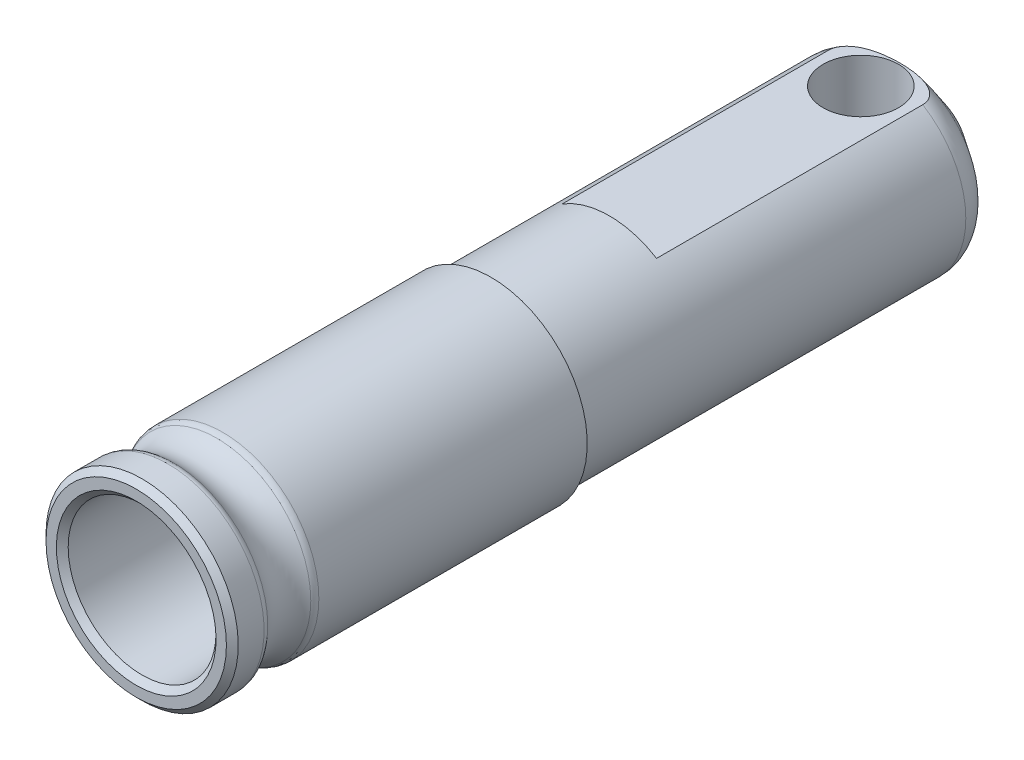
ISO-10303-21;
HEADER;
FILE_DESCRIPTION(('STEP AP214'),'2;1');
FILE_NAME('part.step','',(''),(''),'','','');
FILE_SCHEMA(('AUTOMOTIVE_DESIGN { 1 0 10303 214 1 1 1 1 }'));
ENDSEC;
DATA;
#1=APPLICATION_CONTEXT('core data for automotive mechanical design processes');
#2=APPLICATION_PROTOCOL_DEFINITION('international standard','automotive_design',2000,#1);
#3=PRODUCT_CONTEXT('',#1,'mechanical');
#4=PRODUCT('Part','Part','',(#3));
#5=PRODUCT_RELATED_PRODUCT_CATEGORY('part','',(#4));
#6=PRODUCT_DEFINITION_FORMATION('','',#4);
#7=PRODUCT_DEFINITION_CONTEXT('part definition',#1,'design');
#8=PRODUCT_DEFINITION('design','',#6,#7);
#9=PRODUCT_DEFINITION_SHAPE('','',#8);
#10=(LENGTH_UNIT() NAMED_UNIT(*) SI_UNIT(.MILLI.,.METRE.));
#11=(NAMED_UNIT(*) PLANE_ANGLE_UNIT() SI_UNIT($,.RADIAN.));
#12=(NAMED_UNIT(*) SI_UNIT($,.STERADIAN.) SOLID_ANGLE_UNIT());
#13=UNCERTAINTY_MEASURE_WITH_UNIT(LENGTH_MEASURE(1.E-05),#10,'distance_accuracy_value','');
#14=(GEOMETRIC_REPRESENTATION_CONTEXT(3) GLOBAL_UNCERTAINTY_ASSIGNED_CONTEXT((#13)) GLOBAL_UNIT_ASSIGNED_CONTEXT((#10,
#11,#12)) REPRESENTATION_CONTEXT('',''));
#15=CARTESIAN_POINT('',(0.,0.,0.));
#16=DIRECTION('',(0.,0.,1.));
#17=DIRECTION('',(1.,0.,0.));
#18=AXIS2_PLACEMENT_3D('',#15,#16,#17);
#19=CARTESIAN_POINT('',(0.,0.,-2.));
#20=DIRECTION('',(0.,0.,1.));
#21=DIRECTION('',(1.,0.,0.));
#22=AXIS2_PLACEMENT_3D('',#19,#20,#21);
#23=PLANE('',#22);
#24=CARTESIAN_POINT('',(0.,0.,-2.));
#25=DIRECTION('',(0.,0.,-1.));
#26=DIRECTION('',(-1.,0.,0.));
#27=AXIS2_PLACEMENT_3D('',#24,#25,#26);
#28=CIRCLE('',#27,2.5);
#29=CARTESIAN_POINT('',(-2.5,0.,-2.));
#30=VERTEX_POINT('',#29);
#31=EDGE_CURVE('E272',#30,#30,#28,.F.);
#32=ORIENTED_EDGE('',*,*,#31,.T.);
#33=EDGE_LOOP('',(#32));
#34=FACE_BOUND('',#33,.T.);
#35=ADVANCED_FACE('F24',(#34),#23,.T.);
#36=CARTESIAN_POINT('',(0.,0.,15.));
#37=DIRECTION('',(0.,0.,-1.));
#38=DIRECTION('',(-1.,0.,0.));
#39=AXIS2_PLACEMENT_3D('',#36,#37,#38);
#40=CYLINDRICAL_SURFACE('',#39,2.5);
#41=CARTESIAN_POINT('',(0.,0.,6.79999999999836));
#42=DIRECTION('',(0.,0.,1.));
#43=DIRECTION('',(1.,0.,0.));
#44=AXIS2_PLACEMENT_3D('',#41,#42,#43);
#45=CIRCLE('',#44,2.50000000005457);
#46=CARTESIAN_POINT('',(2.50000000005457,0.,6.79999999999836));
#47=VERTEX_POINT('',#46);
#48=EDGE_CURVE('E268',#47,#47,#45,.T.);
#49=ORIENTED_EDGE('',*,*,#48,.T.);
#50=EDGE_LOOP('',(#49));
#51=FACE_BOUND('',#50,.T.);
#52=ORIENTED_EDGE('',*,*,#31,.F.);
#53=EDGE_LOOP('',(#52));
#54=FACE_BOUND('',#53,.T.);
#55=ADVANCED_FACE('F459',(#51,#54),#40,.F.);
#56=CARTESIAN_POINT('',(0.,0.,6.99999999994816));
#57=DIRECTION('',(0.,0.,1.));
#58=DIRECTION('',(0.,-1.,0.));
#59=AXIS2_PLACEMENT_3D('',#56,#57,#58);
#60=CONICAL_SURFACE('',#59,2.70000000000437,0.785398163397448);
#61=ORIENTED_EDGE('',*,*,#48,.F.);
#62=EDGE_LOOP('',(#61));
#63=FACE_BOUND('',#62,.T.);
#64=CARTESIAN_POINT('',(0.,0.,6.99999999994816));
#65=DIRECTION('',(0.,0.,1.));
#66=DIRECTION('',(0.,-1.,0.));
#67=AXIS2_PLACEMENT_3D('',#64,#65,#66);
#68=CIRCLE('',#67,2.70000000000437);
#69=CARTESIAN_POINT('',(0.,-2.70000000000437,6.99999999994816));
#70=VERTEX_POINT('',#69);
#71=EDGE_CURVE('E271',#70,#70,#68,.F.);
#72=ORIENTED_EDGE('',*,*,#71,.F.);
#73=EDGE_LOOP('',(#72));
#74=FACE_BOUND('',#73,.T.);
#75=ADVANCED_FACE('F450',(#63,#74),#60,.F.);
#76=CARTESIAN_POINT('',(0.,0.,7.));
#77=DIRECTION('',(0.,0.,1.));
#78=DIRECTION('',(1.,0.,0.));
#79=AXIS2_PLACEMENT_3D('',#76,#77,#78);
#80=PLANE('',#79);
#81=CARTESIAN_POINT('',(0.,0.,7.000000000005));
#82=DIRECTION('',(0.,0.,-1.));
#83=DIRECTION('',(0.,1.,0.));
#84=AXIS2_PLACEMENT_3D('',#81,#82,#83);
#85=CIRCLE('',#84,3.04999999997335);
#86=CARTESIAN_POINT('',(0.,3.04999999997335,7.000000000005));
#87=VERTEX_POINT('',#86);
#88=EDGE_CURVE('E277',#87,#87,#85,.T.);
#89=ORIENTED_EDGE('',*,*,#88,.F.);
#90=EDGE_LOOP('',(#89));
#91=FACE_BOUND('',#90,.T.);
#92=ORIENTED_EDGE('',*,*,#71,.T.);
#93=EDGE_LOOP('',(#92));
#94=FACE_BOUND('',#93,.T.);
#95=ADVANCED_FACE('F441',(#91,#94),#80,.T.);
#96=CARTESIAN_POINT('',(0.,0.,6.79999999994152));
#97=DIRECTION('',(0.,0.,-1.));
#98=DIRECTION('',(0.,1.,0.));
#99=AXIS2_PLACEMENT_3D('',#96,#97,#98);
#100=CONICAL_SURFACE('',#99,3.24999999997999,0.78539816325534);
#101=ORIENTED_EDGE('',*,*,#88,.T.);
#102=EDGE_LOOP('',(#101));
#103=FACE_BOUND('',#102,.T.);
#104=CARTESIAN_POINT('',(0.,0.,6.8));
#105=DIRECTION('',(0.,0.,-1.));
#106=DIRECTION('',(-1.,0.,0.));
#107=AXIS2_PLACEMENT_3D('',#104,#105,#106);
#108=CIRCLE('',#107,3.25);
#109=CARTESIAN_POINT('',(-3.25,0.,6.8));
#110=VERTEX_POINT('',#109);
#111=EDGE_CURVE('E273',#110,#110,#108,.T.);
#112=ORIENTED_EDGE('',*,*,#111,.F.);
#113=EDGE_LOOP('',(#112));
#114=FACE_BOUND('',#113,.T.);
#115=ADVANCED_FACE('F433',(#103,#114),#100,.T.);
#116=CARTESIAN_POINT('',(0.,0.,7.));
#117=DIRECTION('',(0.,0.,-1.));
#118=DIRECTION('',(-1.,0.,0.));
#119=AXIS2_PLACEMENT_3D('',#116,#117,#118);
#120=CYLINDRICAL_SURFACE('',#119,3.25);
#121=ORIENTED_EDGE('',*,*,#111,.T.);
#122=EDGE_LOOP('',(#121));
#123=FACE_BOUND('',#122,.T.);
#124=CARTESIAN_POINT('',(-1.7066633817537E-12,0.,5.92601295887262));
#125=DIRECTION('',(0.,0.,-1.));
#126=DIRECTION('',(-1.,0.,0.));
#127=AXIS2_PLACEMENT_3D('',#124,#125,#126);
#128=CIRCLE('',#127,3.25000000000171);
#129=CARTESIAN_POINT('',(-3.25000000000342,0.,5.92601295887263));
#130=VERTEX_POINT('',#129);
#131=EDGE_CURVE('E276',#130,#130,#128,.T.);
#132=ORIENTED_EDGE('',*,*,#131,.F.);
#133=EDGE_LOOP('',(#132));
#134=FACE_BOUND('',#133,.T.);
#135=ADVANCED_FACE('F426',(#123,#134),#120,.T.);
#136=CARTESIAN_POINT('',(-1.7066633817537E-12,0.,5.92601295887262));
#137=DIRECTION('',(0.,0.,-1.));
#138=DIRECTION('',(-1.,0.,0.));
#139=AXIS2_PLACEMENT_3D('',#136,#137,#138);
#140=TOROIDAL_SURFACE('',#139,2.95000000000171,0.3);
#141=ORIENTED_EDGE('',*,*,#131,.T.);
#142=EDGE_LOOP('',(#141));
#143=FACE_BOUND('',#142,.T.);
#144=CARTESIAN_POINT('',(-3.41052809989731E-12,0.,5.72758161054229));
#145=DIRECTION('',(0.,0.,1.));
#146=DIRECTION('',(1.,0.,0.));
#147=AXIS2_PLACEMENT_3D('',#144,#145,#146);
#148=CIRCLE('',#147,3.17500000000299);
#149=CARTESIAN_POINT('',(3.17499999999958,0.,5.72758161054228));
#150=VERTEX_POINT('',#149);
#151=EDGE_CURVE('E104',#150,#150,#148,.T.);
#152=ORIENTED_EDGE('',*,*,#151,.T.);
#153=EDGE_LOOP('',(#152));
#154=FACE_BOUND('',#153,.T.);
#155=ADVANCED_FACE('F126',(#143,#154),#140,.T.);
#156=CARTESIAN_POINT('',(0.,0.,-20.));
#157=DIRECTION('',(0.,0.,-1.));
#158=DIRECTION('',(-1.,0.,0.));
#159=AXIS2_PLACEMENT_3D('',#156,#157,#158);
#160=PLANE('',#159);
#161=CARTESIAN_POINT('',(0.,0.,-20.));
#162=DIRECTION('',(0.,0.,1.));
#163=DIRECTION('',(1.,0.,0.));
#164=AXIS2_PLACEMENT_3D('',#161,#162,#163);
#165=CIRCLE('',#164,0.716666666666765);
#166=CARTESIAN_POINT('',(0.716666666666676,0.,-20.));
#167=VERTEX_POINT('',#166);
#168=CARTESIAN_POINT('',(-0.716666666666853,0.,-20.));
#169=VERTEX_POINT('',#168);
#170=EDGE_CURVE('E100',#167,#169,#165,.T.);
#171=ORIENTED_EDGE('',*,*,#170,.F.);
#172=CARTESIAN_POINT('',(0.,0.,-20.));
#173=DIRECTION('',(0.,0.,1.));
#174=DIRECTION('',(-1.,0.,0.));
#175=AXIS2_PLACEMENT_3D('',#172,#173,#174);
#176=CIRCLE('',#175,0.716666666666765);
#177=EDGE_CURVE('E96',#169,#167,#176,.T.);
#178=ORIENTED_EDGE('',*,*,#177,.F.);
#179=EDGE_LOOP('',(#171,#178));
#180=FACE_BOUND('',#179,.T.);
#181=ADVANCED_FACE('F107',(#180),#160,.T.);
#182=CARTESIAN_POINT('',(-3.41306843898437E-12,0.,5.));
#183=DIRECTION('',(0.,0.,1.));
#184=DIRECTION('',(1.,0.,0.));
#185=AXIS2_PLACEMENT_3D('',#182,#183,#184);
#186=TOROIDAL_SURFACE('',#185,4.00000000000341,1.1);
#187=ORIENTED_EDGE('',*,*,#151,.F.);
#188=EDGE_LOOP('',(#187));
#189=FACE_BOUND('',#188,.T.);
#190=CARTESIAN_POINT('',(-1.70955013071626E-12,0.,4.27241838946452));
#191=DIRECTION('',(0.,0.,1.));
#192=DIRECTION('',(1.,0.,0.));
#193=AXIS2_PLACEMENT_3D('',#190,#191,#192);
#194=CIRCLE('',#193,3.17499999999869);
#195=CARTESIAN_POINT('',(3.17499999999698,0.,4.27241838946452));
#196=VERTEX_POINT('',#195);
#197=EDGE_CURVE('E108',#196,#196,#194,.F.);
#198=ORIENTED_EDGE('',*,*,#197,.F.);
#199=EDGE_LOOP('',(#198));
#200=FACE_BOUND('',#199,.T.);
#201=ADVANCED_FACE('F125',(#189,#200),#186,.F.);
#202=CARTESIAN_POINT('',(-0.716666666666853,0.,-19.));
#203=DIRECTION('',(0.,1.,0.));
#204=DIRECTION('',(-1.,0.,0.));
#205=AXIS2_PLACEMENT_3D('',#202,#203,#204);
#206=CIRCLE('',#205,1.);
#207=TRIMMED_CURVE('',#206,(PARAMETER_VALUE(-2.36980728294869)),
(PARAMETER_VALUE(2.36980728294869)),.T.,.PARAMETER.);
#208=CARTESIAN_POINT('',(0.,0.,-19.));
#209=DIRECTION('',(0.,0.,-1.));
#210=AXIS1_PLACEMENT('',#208,#209);
#211=SURFACE_OF_REVOLUTION('',#207,#210);
#212=ORIENTED_EDGE('',*,*,#177,.T.);
#213=ORIENTED_EDGE('',*,*,#170,.T.);
#214=EDGE_LOOP('',(#212,#213));
#215=FACE_BOUND('',#214,.T.);
#216=CARTESIAN_POINT('',(0.,0.,-19.7999999999752));
#217=DIRECTION('',(0.,0.,1.));
#218=DIRECTION('',(1.,0.,0.));
#219=AXIS2_PLACEMENT_3D('',#216,#217,#218);
#220=CIRCLE('',#219,1.31666666663942);
#221=CARTESIAN_POINT('',(1.31666666663932,0.,-19.7999999999752));
#222=VERTEX_POINT('',#221);
#223=EDGE_CURVE('E156',#222,#222,#220,.T.);
#224=ORIENTED_EDGE('',*,*,#223,.F.);
#225=EDGE_LOOP('',(#224));
#226=FACE_BOUND('',#225,.T.);
#227=ADVANCED_FACE('F98',(#215,#226),#211,.F.);
#228=CARTESIAN_POINT('',(-1.70989654059176E-12,0.,4.07398704113512));
#229=DIRECTION('',(0.,0.,1.));
#230=DIRECTION('',(1.,0.,0.));
#231=AXIS2_PLACEMENT_3D('',#228,#229,#230);
#232=TOROIDAL_SURFACE('',#231,2.9499999999983,0.3);
#233=CARTESIAN_POINT('',(0.,0.,4.07398704113512));
#234=DIRECTION('',(0.,0.,-1.));
#235=DIRECTION('',(-1.,0.,0.));
#236=AXIS2_PLACEMENT_3D('',#233,#234,#235);
#237=CIRCLE('',#236,3.25);
#238=CARTESIAN_POINT('',(-3.25,0.,4.07398704113512));
#239=VERTEX_POINT('',#238);
#240=EDGE_CURVE('E162',#239,#239,#237,.T.);
#241=ORIENTED_EDGE('',*,*,#240,.F.);
#242=EDGE_LOOP('',(#241));
#243=FACE_BOUND('',#242,.T.);
#244=ORIENTED_EDGE('',*,*,#197,.T.);
#245=EDGE_LOOP('',(#244));
#246=FACE_BOUND('',#245,.T.);
#247=ADVANCED_FACE('F150',(#243,#246),#232,.T.);
#248=CARTESIAN_POINT('',(-3.49256214227101E-12,-3.25,-17.5));
#249=DIRECTION('',(0.,1.,0.));
#250=DIRECTION('',(-1.,0.,0.));
#251=AXIS2_PLACEMENT_3D('',#248,#249,#250);
#252=CYLINDRICAL_SURFACE('',#251,1.275);
#253=CARTESIAN_POINT('',(-3.49154732903756E-12,2.6,-17.5));
#254=DIRECTION('',(0.,1.,0.));
#255=DIRECTION('',(-1.,0.,0.));
#256=AXIS2_PLACEMENT_3D('',#253,#254,#255);
#257=CIRCLE('',#256,1.275);
#258=CARTESIAN_POINT('',(-1.27500000000349,2.6,-17.5));
#259=VERTEX_POINT('',#258);
#260=EDGE_CURVE('E159',#259,#259,#257,.T.);
#261=ORIENTED_EDGE('',*,*,#260,.T.);
#262=EDGE_LOOP('',(#261));
#263=FACE_BOUND('',#262,.T.);
#264=CARTESIAN_POINT('',(-3.49244938524507E-12,-2.6,-17.5));
#265=DIRECTION('',(0.,1.,0.));
#266=DIRECTION('',(-1.,0.,0.));
#267=AXIS2_PLACEMENT_3D('',#264,#265,#266);
#268=CIRCLE('',#267,1.275);
#269=CARTESIAN_POINT('',(-1.27500000000349,-2.6,-17.5));
#270=VERTEX_POINT('',#269);
#271=EDGE_CURVE('E181',#270,#270,#268,.F.);
#272=ORIENTED_EDGE('',*,*,#271,.T.);
#273=EDGE_LOOP('',(#272));
#274=FACE_BOUND('',#273,.T.);
#275=ADVANCED_FACE('F292',(#263,#274),#252,.F.);
#276=CARTESIAN_POINT('',(0.,0.,-18.7999999999988));
#277=DIRECTION('',(0.,0.,1.));
#278=DIRECTION('',(1.,0.,0.));
#279=AXIS2_PLACEMENT_3D('',#276,#277,#278);
#280=CONICAL_SURFACE('',#279,2.64999999996017,0.92729521800843);
#281=CARTESIAN_POINT('',(0.,0.,-18.8));
#282=DIRECTION('',(0.,0.,-1.));
#283=DIRECTION('',(-1.,0.,0.));
#284=AXIS2_PLACEMENT_3D('',#281,#282,#283);
#285=CIRCLE('',#284,2.65000000000009);
#286=CARTESIAN_POINT('',(-0.512347538327393,2.6,-18.7999999999958));
#287=VERTEX_POINT('',#286);
#288=CARTESIAN_POINT('',(-0.512347538296274,-2.6,-18.7999999999848));
#289=VERTEX_POINT('',#288);
#290=EDGE_CURVE('E165',#287,#289,#285,.F.);
#291=ORIENTED_EDGE('',*,*,#290,.F.);
#292=CARTESIAN_POINT('',(-0.512347538322927,2.6,-18.7999999999653));
#293=CARTESIAN_POINT('',(-0.427332745589508,2.6,-18.8123767665102));
#294=CARTESIAN_POINT('',(-0.341863986310406,2.6,-18.8217687915117));
#295=CARTESIAN_POINT('',(-0.170928553538625,2.6,-18.834313983532));
#296=CARTESIAN_POINT('',(-0.0854642767766453,2.6,-18.837499999968));
#297=CARTESIAN_POINT('',(0.0854642767473424,2.6,-18.8374999999688));
#298=CARTESIAN_POINT('',(0.170928553509351,2.6,-18.8343139835334));
#299=CARTESIAN_POINT('',(0.341863986281238,2.6,-18.8217687915146));
#300=CARTESIAN_POINT('',(0.427332745560417,2.6,-18.8123767665137));
#301=CARTESIAN_POINT('',(0.512347538293935,2.6,-18.7999999999695));
#302=B_SPLINE_CURVE_WITH_KNOTS('',3,(#292,#293,#294,#295,#296,#297,#298,#299,#300,#301),
.UNSPECIFIED.,.F.,.F.,(4,2,2,2,4),(0.,0.257710646406221,0.514053441173921,0.770396235941626,
1.02810688234785),.UNSPECIFIED.);
#303=CARTESIAN_POINT('',(0.512347538296146,2.6,-18.7999999999848));
#304=VERTEX_POINT('',#303);
#305=EDGE_CURVE('E166',#287,#304,#302,.T.);
#306=ORIENTED_EDGE('',*,*,#305,.T.);
#307=CARTESIAN_POINT('',(0.,0.,-18.8));
#308=DIRECTION('',(0.,0.,-1.));
#309=DIRECTION('',(-1.,0.,0.));
#310=AXIS2_PLACEMENT_3D('',#307,#308,#309);
#311=CIRCLE('',#310,2.65000000000009);
#312=CARTESIAN_POINT('',(0.512347538296098,-2.6,-18.7999999999848));
#313=VERTEX_POINT('',#312);
#314=EDGE_CURVE('E229',#313,#304,#311,.F.);
#315=ORIENTED_EDGE('',*,*,#314,.F.);
#316=CARTESIAN_POINT('',(0.512347538293843,-2.6,-18.7999999999695));
#317=CARTESIAN_POINT('',(0.42733274556276,-2.6,-18.8123767665134));
#318=CARTESIAN_POINT('',(0.341863986286043,-2.6,-18.8217687915141));
#319=CARTESIAN_POINT('',(0.170928553519055,-2.6,-18.8343139835329));
#320=CARTESIAN_POINT('',(0.0854642767594833,-2.6,-18.8374999999684));
#321=CARTESIAN_POINT('',(-0.0854642767596595,-2.6,-18.8374999999684));
#322=CARTESIAN_POINT('',(-0.170928553519231,-2.6,-18.8343139835329));
#323=CARTESIAN_POINT('',(-0.341863986286219,-2.6,-18.8217687915141));
#324=CARTESIAN_POINT('',(-0.427332745562937,-2.6,-18.8123767665134));
#325=CARTESIAN_POINT('',(-0.512347538294019,-2.6,-18.7999999999695));
#326=B_SPLINE_CURVE_WITH_KNOTS('',3,(#316,#317,#318,#319,#320,#321,#322,#323,#324,#325),
.UNSPECIFIED.,.F.,.F.,(4,2,2,2,4),(0.,0.257710646398846,0.514053441159284,0.770396235919723,
1.02810688231857),.UNSPECIFIED.);
#327=EDGE_CURVE('E259',#313,#289,#326,.T.);
#328=ORIENTED_EDGE('',*,*,#327,.T.);
#329=EDGE_LOOP('',(#291,#306,#315,#328));
#330=FACE_BOUND('',#329,.T.);
#331=ORIENTED_EDGE('',*,*,#223,.T.);
#332=EDGE_LOOP('',(#331));
#333=FACE_BOUND('',#332,.T.);
#334=ADVANCED_FACE('F298',(#330,#333),#280,.T.);
#335=CARTESIAN_POINT('',(-16.5,3.25,-9.));
#336=DIRECTION('',(0.,0.,1.));
#337=DIRECTION('',(1.,0.,0.));
#338=AXIS2_PLACEMENT_3D('',#335,#336,#337);
#339=PLANE('',#338);
#340=CARTESIAN_POINT('',(0.,0.,-8.9999999999999));
#341=DIRECTION('',(0.,0.,1.));
#342=DIRECTION('',(1.,0.,0.));
#343=AXIS2_PLACEMENT_3D('',#340,#341,#342);
#344=CIRCLE('',#343,3.05000000000008);
#345=CARTESIAN_POINT('',(1.59452187191028,2.6,-8.9999999999999));
#346=VERTEX_POINT('',#345);
#347=CARTESIAN_POINT('',(-1.5945218719104,2.6,-8.9999999999999));
#348=VERTEX_POINT('',#347);
#349=EDGE_CURVE('E169',#346,#348,#344,.T.);
#350=ORIENTED_EDGE('',*,*,#349,.F.);
#351=DIRECTION('',(1.,0.,0.));
#352=VECTOR('',#351,1.);
#353=CARTESIAN_POINT('',(-16.5,2.6,-8.9999999999999));
#354=LINE('',#353,#352);
#355=EDGE_CURVE('E84',#346,#348,#354,.F.);
#356=ORIENTED_EDGE('',*,*,#355,.T.);
#357=EDGE_LOOP('',(#350,#356));
#358=FACE_BOUND('',#357,.T.);
#359=ADVANCED_FACE('F220',(#358),#339,.F.);
#360=CARTESIAN_POINT('',(-16.5,2.6,-9.));
#361=DIRECTION('',(0.,-1.,0.));
#362=DIRECTION('',(0.,0.,-1.));
#363=AXIS2_PLACEMENT_3D('',#360,#361,#362);
#364=PLANE('',#363);
#365=CARTESIAN_POINT('',(-1.59452187191043,2.6,-18.));
#366=CARTESIAN_POINT('',(-1.59452638455657,2.6,-18.0181365019888));
#367=CARTESIAN_POINT('',(-1.59357716504775,2.6,-18.0362595563638));
#368=CARTESIAN_POINT('',(-1.58982381542157,2.6,-18.072293358425));
#369=CARTESIAN_POINT('',(-1.58702168740023,2.6,-18.0902043140478));
#370=CARTESIAN_POINT('',(-1.57600175233594,2.6,-18.1429680137566));
#371=CARTESIAN_POINT('',(-1.56516746217746,2.6,-18.177301293636));
#372=CARTESIAN_POINT('',(-1.53749789816598,2.6,-18.2432251540065));
#373=CARTESIAN_POINT('',(-1.5206857517359,2.6,-18.27482572918));
#374=CARTESIAN_POINT('',(-1.48218601492308,2.6,-18.3349765692817));
#375=CARTESIAN_POINT('',(-1.46048464149315,2.6,-18.3635178675301));
#376=CARTESIAN_POINT('',(-1.40361380098433,2.6,-18.4283899994032));
#377=CARTESIAN_POINT('',(-1.36658111656009,2.6,-18.4630784351531));
#378=CARTESIAN_POINT('',(-1.28756675336517,2.6,-18.5262062044816));
#379=CARTESIAN_POINT('',(-1.24557578473176,2.6,-18.5546335123855));
#380=CARTESIAN_POINT('',(-1.13035333488108,2.59999999999999,-18.6225000448207));
#381=CARTESIAN_POINT('',(-1.05439718131465,2.6,-18.6572646097585));
#382=CARTESIAN_POINT('',(-0.898290173350697,2.6,-18.715431362123));
#383=CARTESIAN_POINT('',(-0.818128034002298,2.6,-18.7388010472013));
#384=CARTESIAN_POINT('',(-0.699787609320912,2.6,-18.7665764914759));
#385=CARTESIAN_POINT('',(-0.662364066083862,2.6,-18.7744010137588));
#386=CARTESIAN_POINT('',(-0.587442580602268,2.6,-18.7883795353442));
#387=CARTESIAN_POINT('',(-0.54994650681275,2.6,-18.794543499013));
#388=CARTESIAN_POINT('',(-0.512347538327349,2.6,-18.7999999999958));
#389=B_SPLINE_CURVE_WITH_KNOTS('',3,(#365,#366,#367,#368,#369,#370,#371,#372,#373,#374,#375,
#376,#377,#378,#379,#380,#381,#382,#383,#384,#385,#386,#387,#388),.UNSPECIFIED.,.F.,.F.,(4,2,2,
2,2,2,2,2,2,2,2,4),(0.,0.05435950062088,0.108660360737127,0.215938070539348,0.322805175998554,
0.429977402492624,0.581352056766432,0.733014967075772,0.982209476205451,1.23211068022507,
1.34678143385737,1.46074793888463),.UNSPECIFIED.);
#390=CARTESIAN_POINT('',(-1.59452187191043,2.6,-18.));
#391=VERTEX_POINT('',#390);
#392=EDGE_CURVE('E172',#391,#287,#389,.T.);
#393=ORIENTED_EDGE('',*,*,#392,.F.);
#394=DIRECTION('',(0.,0.,1.));
#395=VECTOR('',#394,1.);
#396=CARTESIAN_POINT('',(-1.59452187190685,2.6,1008.));
#397=LINE('',#396,#395);
#398=EDGE_CURVE('E173',#348,#391,#397,.F.);
#399=ORIENTED_EDGE('',*,*,#398,.F.);
#400=ORIENTED_EDGE('',*,*,#355,.F.);
#401=DIRECTION('',(0.,0.,1.));
#402=VECTOR('',#401,1.);
#403=CARTESIAN_POINT('',(1.59452187191383,2.6,1008.));
#404=LINE('',#403,#402);
#405=CARTESIAN_POINT('',(1.59452187191025,2.6,-18.));
#406=VERTEX_POINT('',#405);
#407=EDGE_CURVE('E167',#406,#346,#404,.T.);
#408=ORIENTED_EDGE('',*,*,#407,.F.);
#409=CARTESIAN_POINT('',(0.512347538298357,2.6,-18.8));
#410=CARTESIAN_POINT('',(0.563149448722196,2.6,-18.7926081694088));
#411=CARTESIAN_POINT('',(0.61380461900709,2.6,-18.78394851083));
#412=CARTESIAN_POINT('',(0.714710855837846,2.6,-18.7635167409459));
#413=CARTESIAN_POINT('',(0.764959138755041,2.6,-18.7517310137461));
#414=CARTESIAN_POINT('',(0.865204347269636,2.6,-18.7243296528722));
#415=CARTESIAN_POINT('',(0.915187139718743,2.6,-18.7086611193684));
#416=CARTESIAN_POINT('',(1.01346325078016,2.6,-18.6728861986748));
#417=CARTESIAN_POINT('',(1.06175966057001,2.6,-18.6527884850459));
#418=CARTESIAN_POINT('',(1.15163364416096,2.6,-18.6093338311628));
#419=CARTESIAN_POINT('',(1.19342609106626,2.60000000000001,-18.5864281359831));
#420=CARTESIAN_POINT('',(1.27379912075539,2.59999999999999,-18.5355840304833));
#421=CARTESIAN_POINT('',(1.31238484567648,2.59999999999995,-18.5076539139705));
#422=CARTESIAN_POINT('',(1.38539400495647,2.60000000000001,-18.4456991911289));
#423=CARTESIAN_POINT('',(1.41974816846823,2.60000000000011,-18.4115912830682));
#424=CARTESIAN_POINT('',(1.48124288023945,2.59999999999989,-18.3373612302481));
#425=CARTESIAN_POINT('',(1.50840410367524,2.59999999999958,-18.2972568531334));
#426=CARTESIAN_POINT('',(1.54492035381436,2.59999999999971,-18.2269056458753));
#427=CARTESIAN_POINT('',(1.557177895898,2.59999999999993,-18.198156395604));
#428=CARTESIAN_POINT('',(1.57675457982231,2.60000000000008,-18.1390388655556));
#429=CARTESIAN_POINT('',(1.58408426986133,2.60000000000001,-18.108674195055));
#430=CARTESIAN_POINT('',(1.59063151780417,2.59999999999999,-18.0650362199837));
#431=CARTESIAN_POINT('',(1.59208827642377,2.6,-18.0520705204712));
#432=CARTESIAN_POINT('',(1.59403336572927,2.6,-18.0260720588636));
#433=CARTESIAN_POINT('',(1.59452208969527,2.60000000000001,-18.0130393261603));
#434=CARTESIAN_POINT('',(1.59452187191025,2.6,-18.));
#435=B_SPLINE_CURVE_WITH_KNOTS('',3,(#409,#410,#411,#412,#413,#414,#415,#416,#417,#418,#419,
#420,#421,#422,#423,#424,#425,#426,#427,#428,#429,#430,#431,#432,#433,#434),.UNSPECIFIED.,.F.,
.F.,(4,2,2,2,2,2,2,2,2,2,2,2,4),(0.,0.154050765632774,0.308783858109109,0.465753667288842,
0.622418775181399,0.765095356129828,0.907538546731808,1.05206885101855,1.1961790981966,
1.28957553046733,1.38277140321643,1.42188324686408,1.46097919741619),.UNSPECIFIED.);
#436=EDGE_CURVE('E170',#304,#406,#435,.T.);
#437=ORIENTED_EDGE('',*,*,#436,.F.);
#438=ORIENTED_EDGE('',*,*,#305,.F.);
#439=EDGE_LOOP('',(#393,#399,#400,#408,#437,#438));
#440=FACE_BOUND('',#439,.T.);
#441=ORIENTED_EDGE('',*,*,#260,.F.);
#442=EDGE_LOOP('',(#441));
#443=FACE_BOUND('',#442,.T.);
#444=ADVANCED_FACE('F216',(#440,#443),#364,.F.);
#445=CARTESIAN_POINT('',(0.,0.,7.));
#446=DIRECTION('',(0.,0.,-1.));
#447=DIRECTION('',(-1.,0.,0.));
#448=AXIS2_PLACEMENT_3D('',#445,#446,#447);
#449=CYLINDRICAL_SURFACE('',#448,3.25);
#450=ORIENTED_EDGE('',*,*,#240,.T.);
#451=EDGE_LOOP('',(#450));
#452=FACE_BOUND('',#451,.T.);
#453=CARTESIAN_POINT('',(0.,0.,-4.99999999999998));
#454=DIRECTION('',(0.,0.,-1.));
#455=DIRECTION('',(-1.,0.,0.));
#456=AXIS2_PLACEMENT_3D('',#453,#454,#455);
#457=CIRCLE('',#456,3.25);
#458=CARTESIAN_POINT('',(-3.25,0.,-4.99999999999998));
#459=VERTEX_POINT('',#458);
#460=EDGE_CURVE('E176',#459,#459,#457,.F.);
#461=ORIENTED_EDGE('',*,*,#460,.T.);
#462=EDGE_LOOP('',(#461));
#463=FACE_BOUND('',#462,.T.);
#464=ADVANCED_FACE('F193',(#452,#463),#449,.T.);
#465=CARTESIAN_POINT('',(0.,0.,-18.));
#466=DIRECTION('',(0.,0.,-1.));
#467=DIRECTION('',(-1.,0.,0.));
#468=AXIS2_PLACEMENT_3D('',#465,#466,#467);
#469=TOROIDAL_SURFACE('',#468,2.05000000000008,1.);
#470=ORIENTED_EDGE('',*,*,#290,.T.);
#471=CARTESIAN_POINT('',(-0.512347538298441,-2.6,-18.8));
#472=CARTESIAN_POINT('',(-0.563149448722283,-2.6,-18.7926081694088));
#473=CARTESIAN_POINT('',(-0.613804619007181,-2.6,-18.78394851083));
#474=CARTESIAN_POINT('',(-0.714710855837942,-2.6,-18.7635167409459));
#475=CARTESIAN_POINT('',(-0.764959138755141,-2.6,-18.7517310137461));
#476=CARTESIAN_POINT('',(-0.865204347269743,-2.6,-18.7243296528722));
#477=CARTESIAN_POINT('',(-0.915187139718855,-2.6,-18.7086611193684));
#478=CARTESIAN_POINT('',(-1.01346325078028,-2.6,-18.6728861986748));
#479=CARTESIAN_POINT('',(-1.06175966057013,-2.6,-18.6527884850459));
#480=CARTESIAN_POINT('',(-1.15163364416109,-2.6,-18.6093338311629));
#481=CARTESIAN_POINT('',(-1.1934260910664,-2.60000000000001,-18.5864281359832));
#482=CARTESIAN_POINT('',(-1.27379912075554,-2.59999999999999,-18.5355840304834));
#483=CARTESIAN_POINT('',(-1.31238484567663,-2.59999999999996,-18.5076539139705));
#484=CARTESIAN_POINT('',(-1.38539400495663,-2.60000000000002,-18.445699191129));
#485=CARTESIAN_POINT('',(-1.41974816846839,-2.60000000000011,-18.4115912830682));
#486=CARTESIAN_POINT('',(-1.48124288023962,-2.59999999999989,-18.3373612302481));
#487=CARTESIAN_POINT('',(-1.5084041036754,-2.59999999999958,-18.2972568531334));
#488=CARTESIAN_POINT('',(-1.54492035381453,-2.59999999999971,-18.2269056458753));
#489=CARTESIAN_POINT('',(-1.55717789589817,-2.59999999999993,-18.198156395604));
#490=CARTESIAN_POINT('',(-1.57675457982248,-2.60000000000008,-18.1390388655556));
#491=CARTESIAN_POINT('',(-1.58408426986151,-2.60000000000001,-18.1086741950551));
#492=CARTESIAN_POINT('',(-1.59063151780435,-2.6,-18.0650362199837));
#493=CARTESIAN_POINT('',(-1.59208827642395,-2.6,-18.0520705204712));
#494=CARTESIAN_POINT('',(-1.59403336572945,-2.6,-18.0260720588636));
#495=CARTESIAN_POINT('',(-1.59452208969545,-2.60000000000001,-18.0130393261603));
#496=CARTESIAN_POINT('',(-1.59452187191043,-2.6,-18.));
#497=B_SPLINE_CURVE_WITH_KNOTS('',3,(#471,#472,#473,#474,#475,#476,#477,#478,#479,#480,#481,
#482,#483,#484,#485,#486,#487,#488,#489,#490,#491,#492,#493,#494,#495,#496),.UNSPECIFIED.,.F.,
.F.,(4,2,2,2,2,2,2,2,2,2,2,2,4),(0.,0.154050765632784,0.308783858109126,0.46575366728887,
0.622418775181438,0.765095356129877,0.907538546731865,1.05206885101862,1.19617909819667,
1.2895755304674,1.38277140321651,1.42188324686416,1.46097919741628),.UNSPECIFIED.);
#498=CARTESIAN_POINT('',(-1.59452187191043,-2.6,-18.));
#499=VERTEX_POINT('',#498);
#500=EDGE_CURVE('E198',#289,#499,#497,.T.);
#501=ORIENTED_EDGE('',*,*,#500,.T.);
#502=CARTESIAN_POINT('',(0.,0.,-18.));
#503=DIRECTION('',(0.,0.,1.));
#504=DIRECTION('',(1.,0.,0.));
#505=AXIS2_PLACEMENT_3D('',#502,#503,#504);
#506=CIRCLE('',#505,3.05000000000008);
#507=EDGE_CURVE('E70',#391,#499,#506,.T.);
#508=ORIENTED_EDGE('',*,*,#507,.F.);
#509=ORIENTED_EDGE('',*,*,#392,.T.);
#510=EDGE_LOOP('',(#470,#501,#508,#509));
#511=FACE_BOUND('',#510,.T.);
#512=ADVANCED_FACE('F187',(#511),#469,.T.);
#513=CARTESIAN_POINT('',(-16.5,-3.25,-9.));
#514=DIRECTION('',(0.,0.,1.));
#515=DIRECTION('',(1.,0.,0.));
#516=AXIS2_PLACEMENT_3D('',#513,#514,#515);
#517=PLANE('',#516);
#518=CARTESIAN_POINT('',(0.,0.,-8.9999999999999));
#519=DIRECTION('',(0.,0.,1.));
#520=DIRECTION('',(1.,0.,0.));
#521=AXIS2_PLACEMENT_3D('',#518,#519,#520);
#522=CIRCLE('',#521,3.05000000000008);
#523=CARTESIAN_POINT('',(-1.5945218719104,-2.6,-8.9999999999999));
#524=VERTEX_POINT('',#523);
#525=CARTESIAN_POINT('',(1.59452187191028,-2.6,-8.9999999999999));
#526=VERTEX_POINT('',#525);
#527=EDGE_CURVE('E256',#524,#526,#522,.T.);
#528=ORIENTED_EDGE('',*,*,#527,.F.);
#529=DIRECTION('',(1.,0.,0.));
#530=VECTOR('',#529,1.);
#531=CARTESIAN_POINT('',(-16.5,-2.6,-8.9999999999999));
#532=LINE('',#531,#530);
#533=EDGE_CURVE('E257',#524,#526,#532,.T.);
#534=ORIENTED_EDGE('',*,*,#533,.T.);
#535=EDGE_LOOP('',(#528,#534));
#536=FACE_BOUND('',#535,.T.);
#537=ADVANCED_FACE('F192',(#536),#517,.F.);
#538=CARTESIAN_POINT('',(-16.5,-2.6,-9.));
#539=DIRECTION('',(0.,1.,0.));
#540=DIRECTION('',(0.,0.,1.));
#541=AXIS2_PLACEMENT_3D('',#538,#539,#540);
#542=PLANE('',#541);
#543=ORIENTED_EDGE('',*,*,#500,.F.);
#544=ORIENTED_EDGE('',*,*,#327,.F.);
#545=CARTESIAN_POINT('',(1.59452187191025,-2.6,-18.));
#546=CARTESIAN_POINT('',(1.59452638455639,-2.6,-18.0181365019888));
#547=CARTESIAN_POINT('',(1.59357716504757,-2.6,-18.0362595563638));
#548=CARTESIAN_POINT('',(1.58982381542139,-2.6,-18.072293358425));
#549=CARTESIAN_POINT('',(1.58702168740005,-2.6,-18.0902043140478));
#550=CARTESIAN_POINT('',(1.57600175233577,-2.6,-18.1429680137566));
#551=CARTESIAN_POINT('',(1.56516746217728,-2.6,-18.177301293636));
#552=CARTESIAN_POINT('',(1.53749789816581,-2.6,-18.2432251540065));
#553=CARTESIAN_POINT('',(1.52068575173573,-2.6,-18.27482572918));
#554=CARTESIAN_POINT('',(1.4821860149229,-2.6,-18.3349765692817));
#555=CARTESIAN_POINT('',(1.46048464149297,-2.6,-18.3635178675301));
#556=CARTESIAN_POINT('',(1.40361380098416,-2.6,-18.4283899994032));
#557=CARTESIAN_POINT('',(1.36658111655991,-2.6,-18.4630784351531));
#558=CARTESIAN_POINT('',(1.287566753365,-2.6,-18.5262062044816));
#559=CARTESIAN_POINT('',(1.24557578473158,-2.6,-18.5546335123855));
#560=CARTESIAN_POINT('',(1.13035333488092,-2.59999999999999,-18.6225000448207));
#561=CARTESIAN_POINT('',(1.0543971813145,-2.6,-18.6572646097585));
#562=CARTESIAN_POINT('',(0.898290173350556,-2.6,-18.715431362123));
#563=CARTESIAN_POINT('',(0.818128034002148,-2.6,-18.7388010472013));
#564=CARTESIAN_POINT('',(0.699787609315979,-2.6,-18.766576491477));
#565=CARTESIAN_POINT('',(0.662364066074105,-2.6,-18.7744010137608));
#566=CARTESIAN_POINT('',(0.587442580582856,-2.6,-18.7883795353476));
#567=CARTESIAN_POINT('',(0.549946506788509,-2.6,-18.7945434990169));
#568=CARTESIAN_POINT('',(0.512347538298265,-2.6,-18.8));
#569=B_SPLINE_CURVE_WITH_KNOTS('',3,(#545,#546,#547,#548,#549,#550,#551,#552,#553,#554,#555,
#556,#557,#558,#559,#560,#561,#562,#563,#564,#565,#566,#567,#568),.UNSPECIFIED.,.F.,.F.,(4,2,2,
2,2,2,2,2,2,2,2,4),(0.,0.05435950062088,0.108660360737127,0.215938070539344,0.322805175998545,
0.42997740249262,0.581352056766429,0.733014967075763,0.982209476205399,1.23211068022505,
1.34678143387205,1.46074793891383),.UNSPECIFIED.);
#570=CARTESIAN_POINT('',(1.59452187191024,-2.6,-18.));
#571=VERTEX_POINT('',#570);
#572=EDGE_CURVE('E44',#571,#313,#569,.T.);
#573=ORIENTED_EDGE('',*,*,#572,.F.);
#574=DIRECTION('',(0.,0.,1.));
#575=VECTOR('',#574,1.);
#576=CARTESIAN_POINT('',(1.59452187191382,-2.60000000000001,1008.));
#577=LINE('',#576,#575);
#578=EDGE_CURVE('E254',#526,#571,#577,.F.);
#579=ORIENTED_EDGE('',*,*,#578,.F.);
#580=ORIENTED_EDGE('',*,*,#533,.F.);
#581=DIRECTION('',(0.,0.,1.));
#582=VECTOR('',#581,1.);
#583=CARTESIAN_POINT('',(-1.59452187190685,-2.6,1008.));
#584=LINE('',#583,#582);
#585=EDGE_CURVE('E260',#499,#524,#584,.T.);
#586=ORIENTED_EDGE('',*,*,#585,.F.);
#587=EDGE_LOOP('',(#543,#544,#573,#579,#580,#586));
#588=FACE_BOUND('',#587,.T.);
#589=ORIENTED_EDGE('',*,*,#271,.F.);
#590=EDGE_LOOP('',(#589));
#591=FACE_BOUND('',#590,.T.);
#592=ADVANCED_FACE('F240',(#588,#591),#542,.F.);
#593=CARTESIAN_POINT('',(0.,0.,-18.));
#594=DIRECTION('',(0.,0.,-1.));
#595=DIRECTION('',(-1.,0.,0.));
#596=AXIS2_PLACEMENT_3D('',#593,#594,#595);
#597=TOROIDAL_SURFACE('',#596,2.05000000000008,1.);
#598=ORIENTED_EDGE('',*,*,#436,.T.);
#599=CARTESIAN_POINT('',(0.,0.,-18.));
#600=DIRECTION('',(0.,0.,1.));
#601=DIRECTION('',(1.,0.,0.));
#602=AXIS2_PLACEMENT_3D('',#599,#600,#601);
#603=CIRCLE('',#602,3.05000000000008);
#604=EDGE_CURVE('E35',#571,#406,#603,.T.);
#605=ORIENTED_EDGE('',*,*,#604,.F.);
#606=ORIENTED_EDGE('',*,*,#572,.T.);
#607=ORIENTED_EDGE('',*,*,#314,.T.);
#608=EDGE_LOOP('',(#598,#605,#606,#607));
#609=FACE_BOUND('',#608,.T.);
#610=ADVANCED_FACE('F234',(#609),#597,.T.);
#611=CARTESIAN_POINT('',(3.78108887084417,0.,-5.));
#612=DIRECTION('',(0.,0.,1.));
#613=DIRECTION('',(1.,0.,0.));
#614=AXIS2_PLACEMENT_3D('',#611,#612,#613);
#615=PLANE('',#614);
#616=ORIENTED_EDGE('',*,*,#460,.F.);
#617=EDGE_LOOP('',(#616));
#618=FACE_BOUND('',#617,.T.);
#619=CARTESIAN_POINT('',(0.,0.,-4.99999999999989));
#620=DIRECTION('',(0.,0.,1.));
#621=DIRECTION('',(1.,0.,0.));
#622=AXIS2_PLACEMENT_3D('',#619,#620,#621);
#623=CIRCLE('',#622,3.05000000000008);
#624=CARTESIAN_POINT('',(3.05000000000003,0.,-4.9999999999999));
#625=VERTEX_POINT('',#624);
#626=EDGE_CURVE('E13',#625,#625,#623,.F.);
#627=ORIENTED_EDGE('',*,*,#626,.F.);
#628=EDGE_LOOP('',(#627));
#629=FACE_BOUND('',#628,.T.);
#630=ADVANCED_FACE('F239',(#618,#629),#615,.F.);
#631=CARTESIAN_POINT('',(3.49148336110938E-12,0.,1008.));
#632=DIRECTION('',(0.,0.,1.));
#633=DIRECTION('',(1.,0.,0.));
#634=AXIS2_PLACEMENT_3D('',#631,#632,#633);
#635=CYLINDRICAL_SURFACE('',#634,3.05000000000008);
#636=ORIENTED_EDGE('',*,*,#398,.T.);
#637=ORIENTED_EDGE('',*,*,#507,.T.);
#638=ORIENTED_EDGE('',*,*,#585,.T.);
#639=ORIENTED_EDGE('',*,*,#527,.T.);
#640=ORIENTED_EDGE('',*,*,#578,.T.);
#641=ORIENTED_EDGE('',*,*,#604,.T.);
#642=ORIENTED_EDGE('',*,*,#407,.T.);
#643=ORIENTED_EDGE('',*,*,#349,.T.);
#644=EDGE_LOOP('',(#636,#637,#638,#639,#640,#641,#642,#643));
#645=FACE_BOUND('',#644,.T.);
#646=ORIENTED_EDGE('',*,*,#626,.T.);
#647=EDGE_LOOP('',(#646));
#648=FACE_BOUND('',#647,.T.);
#649=ADVANCED_FACE('F301',(#645,#648),#635,.T.);
#650=CLOSED_SHELL('',(#35,#55,#75,#95,#115,#135,#155,#181,#201,#227,#247,#275,#334,#359,#444,
#464,#512,#537,#592,#610,#630,#649));
#651=MANIFOLD_SOLID_BREP('B1',#650);
#652=ADVANCED_BREP_SHAPE_REPRESENTATION('',(#18,#651),#14);
#653=SHAPE_DEFINITION_REPRESENTATION(#9,#652);
ENDSEC;
END-ISO-10303-21;
